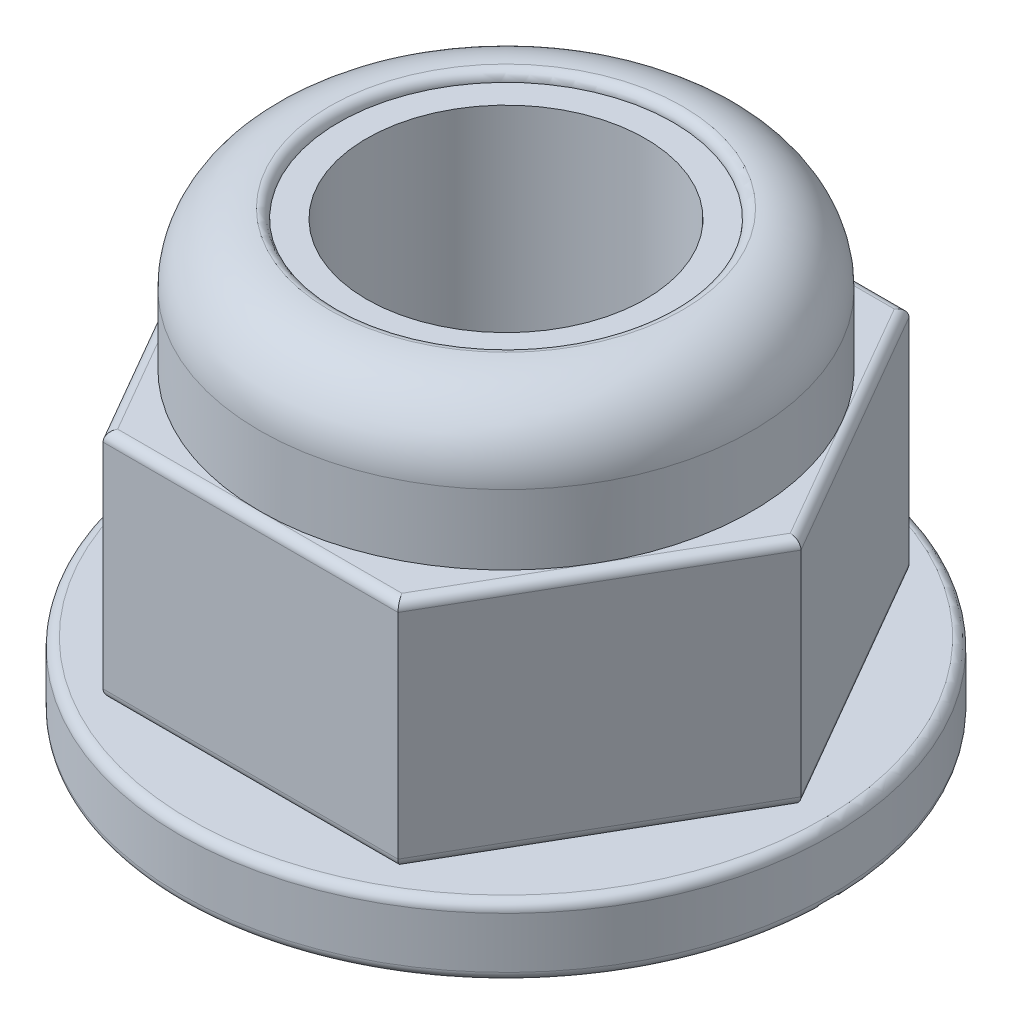
ISO-10303-21;
HEADER;
FILE_DESCRIPTION(('STEP AP214'),'2;1');
FILE_NAME('part.step','',(''),(''),'','','');
FILE_SCHEMA(('AUTOMOTIVE_DESIGN { 1 0 10303 214 1 1 1 1 }'));
ENDSEC;
DATA;
#1=APPLICATION_CONTEXT('core data for automotive mechanical design processes');
#2=APPLICATION_PROTOCOL_DEFINITION('international standard','automotive_design',2000,#1);
#3=PRODUCT_CONTEXT('',#1,'mechanical');
#4=PRODUCT('Part','Part','',(#3));
#5=PRODUCT_RELATED_PRODUCT_CATEGORY('part','',(#4));
#6=PRODUCT_DEFINITION_FORMATION('','',#4);
#7=PRODUCT_DEFINITION_CONTEXT('part definition',#1,'design');
#8=PRODUCT_DEFINITION('design','',#6,#7);
#9=PRODUCT_DEFINITION_SHAPE('','',#8);
#10=(LENGTH_UNIT() NAMED_UNIT(*) SI_UNIT(.MILLI.,.METRE.));
#11=(NAMED_UNIT(*) PLANE_ANGLE_UNIT() SI_UNIT($,.RADIAN.));
#12=(NAMED_UNIT(*) SI_UNIT($,.STERADIAN.) SOLID_ANGLE_UNIT());
#13=UNCERTAINTY_MEASURE_WITH_UNIT(LENGTH_MEASURE(1.E-05),#10,'distance_accuracy_value','');
#14=(GEOMETRIC_REPRESENTATION_CONTEXT(3) GLOBAL_UNCERTAINTY_ASSIGNED_CONTEXT((#13)) GLOBAL_UNIT_ASSIGNED_CONTEXT((#10,
#11,#12)) REPRESENTATION_CONTEXT('',''));
#15=CARTESIAN_POINT('',(0.,0.,0.));
#16=DIRECTION('',(0.,0.,1.));
#17=DIRECTION('',(1.,0.,0.));
#18=AXIS2_PLACEMENT_3D('',#15,#16,#17);
#19=CARTESIAN_POINT('',(0.,4.,0.));
#20=DIRECTION('',(0.,-1.,0.));
#21=DIRECTION('',(0.,0.,-1.));
#22=AXIS2_PLACEMENT_3D('',#19,#20,#21);
#23=CYLINDRICAL_SURFACE('',#22,1.5);
#24=CARTESIAN_POINT('',(0.,0.0999999999999998,0.));
#25=DIRECTION('',(0.,1.,0.));
#26=DIRECTION('',(0.,0.,1.));
#27=AXIS2_PLACEMENT_3D('',#24,#25,#26);
#28=CIRCLE('',#27,1.5);
#29=CARTESIAN_POINT('',(0.,0.0999999999999998,1.5));
#30=VERTEX_POINT('',#29);
#31=EDGE_CURVE('E174',#30,#30,#28,.F.);
#32=ORIENTED_EDGE('',*,*,#31,.T.);
#33=EDGE_LOOP('',(#32));
#34=FACE_BOUND('',#33,.T.);
#35=CARTESIAN_POINT('',(0.,3.9,0.));
#36=DIRECTION('',(0.,1.,0.));
#37=DIRECTION('',(0.,0.,1.));
#38=AXIS2_PLACEMENT_3D('',#35,#36,#37);
#39=CIRCLE('',#38,1.5);
#40=CARTESIAN_POINT('',(0.,3.9,1.5));
#41=VERTEX_POINT('',#40);
#42=EDGE_CURVE('E694',#41,#41,#39,.T.);
#43=ORIENTED_EDGE('',*,*,#42,.T.);
#44=EDGE_LOOP('',(#43));
#45=FACE_BOUND('',#44,.T.);
#46=ADVANCED_FACE('F33',(#34,#45),#23,.F.);
#47=CARTESIAN_POINT('',(0.,2.5,2.65));
#48=DIRECTION('',(0.,-1.,0.));
#49=DIRECTION('',(0.,0.,-1.));
#50=AXIS2_PLACEMENT_3D('',#47,#48,#49);
#51=PLANE('',#50);
#52=DIRECTION('',(-1.,0.,0.));
#53=VECTOR('',#52,1.);
#54=CARTESIAN_POINT('',(0.,2.5,2.65));
#55=LINE('',#54,#53);
#56=CARTESIAN_POINT('',(0.,2.5,2.65));
#57=VERTEX_POINT('',#56);
#58=CARTESIAN_POINT('',(1.52997821335251,2.5,2.65));
#59=VERTEX_POINT('',#58);
#60=EDGE_CURVE('E48',#57,#59,#55,.F.);
#61=ORIENTED_EDGE('',*,*,#60,.T.);
#62=DIRECTION('',(-0.5,0.,0.866025403784439));
#63=VECTOR('',#62,1.);
#64=CARTESIAN_POINT('',(1.14748366001438,2.5,3.3125));
#65=LINE('',#64,#63);
#66=CARTESIAN_POINT('',(2.29496732002876,2.5,1.325));
#67=VERTEX_POINT('',#66);
#68=EDGE_CURVE('E227',#59,#67,#65,.F.);
#69=ORIENTED_EDGE('',*,*,#68,.T.);
#70=CARTESIAN_POINT('',(0.,2.5,0.));
#71=DIRECTION('',(0.,1.,0.));
#72=DIRECTION('',(0.,0.,1.));
#73=AXIS2_PLACEMENT_3D('',#70,#71,#72);
#74=CIRCLE('',#73,2.65);
#75=EDGE_CURVE('E679',#57,#67,#74,.T.);
#76=ORIENTED_EDGE('',*,*,#75,.F.);
#77=EDGE_LOOP('',(#61,#69,#76));
#78=FACE_BOUND('',#77,.T.);
#79=ADVANCED_FACE('F301',(#78),#51,.F.);
#80=CARTESIAN_POINT('',(2.29496732002876,2.5,-1.325));
#81=VERTEX_POINT('',#80);
#82=EDGE_CURVE('E680',#67,#81,#74,.T.);
#83=ORIENTED_EDGE('',*,*,#82,.F.);
#84=DIRECTION('',(-0.5,0.,0.866025403784439));
#85=VECTOR('',#84,1.);
#86=CARTESIAN_POINT('',(1.14748366001438,2.5,3.3125));
#87=LINE('',#86,#85);
#88=CARTESIAN_POINT('',(3.05995642670502,2.5,0.));
#89=VERTEX_POINT('',#88);
#90=EDGE_CURVE('E56',#67,#89,#87,.F.);
#91=ORIENTED_EDGE('',*,*,#90,.T.);
#92=DIRECTION('',(0.5,0.,0.866025403784439));
#93=VECTOR('',#92,1.);
#94=CARTESIAN_POINT('',(3.44245098004314,2.5,0.6625));
#95=LINE('',#94,#93);
#96=EDGE_CURVE('E223',#89,#81,#95,.F.);
#97=ORIENTED_EDGE('',*,*,#96,.T.);
#98=EDGE_LOOP('',(#83,#91,#97));
#99=FACE_BOUND('',#98,.T.);
#100=ADVANCED_FACE('F307',(#99),#51,.F.);
#101=CARTESIAN_POINT('',(0.,2.5,-2.65));
#102=VERTEX_POINT('',#101);
#103=EDGE_CURVE('E668',#81,#102,#74,.T.);
#104=ORIENTED_EDGE('',*,*,#103,.F.);
#105=DIRECTION('',(0.5,0.,0.866025403784439));
#106=VECTOR('',#105,1.);
#107=CARTESIAN_POINT('',(3.44245098004314,2.5,0.6625));
#108=LINE('',#107,#106);
#109=CARTESIAN_POINT('',(1.52997821335251,2.5,-2.65));
#110=VERTEX_POINT('',#109);
#111=EDGE_CURVE('E221',#81,#110,#108,.F.);
#112=ORIENTED_EDGE('',*,*,#111,.T.);
#113=DIRECTION('',(1.,0.,0.));
#114=VECTOR('',#113,1.);
#115=CARTESIAN_POINT('',(0.,2.5,-2.65));
#116=LINE('',#115,#114);
#117=EDGE_CURVE('E218',#110,#102,#116,.F.);
#118=ORIENTED_EDGE('',*,*,#117,.T.);
#119=EDGE_LOOP('',(#104,#112,#118));
#120=FACE_BOUND('',#119,.T.);
#121=ADVANCED_FACE('F547',(#120),#51,.F.);
#122=CARTESIAN_POINT('',(-2.29496732002876,2.5,-1.325));
#123=VERTEX_POINT('',#122);
#124=EDGE_CURVE('E660',#102,#123,#74,.T.);
#125=ORIENTED_EDGE('',*,*,#124,.F.);
#126=DIRECTION('',(1.,0.,0.));
#127=VECTOR('',#126,1.);
#128=CARTESIAN_POINT('',(0.,2.5,-2.65));
#129=LINE('',#128,#127);
#130=CARTESIAN_POINT('',(-1.52997821335251,2.5,-2.65));
#131=VERTEX_POINT('',#130);
#132=EDGE_CURVE('E216',#102,#131,#129,.F.);
#133=ORIENTED_EDGE('',*,*,#132,.T.);
#134=DIRECTION('',(0.5,0.,-0.866025403784439));
#135=VECTOR('',#134,1.);
#136=CARTESIAN_POINT('',(-3.44245098004314,2.5,0.6625));
#137=LINE('',#136,#135);
#138=EDGE_CURVE('E212',#131,#123,#137,.F.);
#139=ORIENTED_EDGE('',*,*,#138,.T.);
#140=EDGE_LOOP('',(#125,#133,#139));
#141=FACE_BOUND('',#140,.T.);
#142=ADVANCED_FACE('F554',(#141),#51,.F.);
#143=DIRECTION('',(-0.5,0.,-0.866025403784439));
#144=VECTOR('',#143,1.);
#145=CARTESIAN_POINT('',(-1.14748366001438,2.5,3.3125));
#146=LINE('',#145,#144);
#147=CARTESIAN_POINT('',(-2.29496732002876,2.5,1.325));
#148=VERTEX_POINT('',#147);
#149=CARTESIAN_POINT('',(-1.52997821335251,2.5,2.65));
#150=VERTEX_POINT('',#149);
#151=EDGE_CURVE('E206',#148,#150,#146,.F.);
#152=ORIENTED_EDGE('',*,*,#151,.T.);
#153=DIRECTION('',(-1.,0.,0.));
#154=VECTOR('',#153,1.);
#155=CARTESIAN_POINT('',(0.,2.5,2.65));
#156=LINE('',#155,#154);
#157=EDGE_CURVE('E214',#150,#57,#156,.F.);
#158=ORIENTED_EDGE('',*,*,#157,.T.);
#159=EDGE_CURVE('E661',#148,#57,#74,.T.);
#160=ORIENTED_EDGE('',*,*,#159,.F.);
#161=EDGE_LOOP('',(#152,#158,#160));
#162=FACE_BOUND('',#161,.T.);
#163=ADVANCED_FACE('F337',(#162),#51,.F.);
#164=CARTESIAN_POINT('',(-1.58771324027147,4.,2.75));
#165=DIRECTION('',(0.,0.,-1.));
#166=DIRECTION('',(-1.,0.,0.));
#167=AXIS2_PLACEMENT_3D('',#164,#165,#166);
#168=PLANE('',#167);
#169=DIRECTION('',(0.,-1.,0.));
#170=VECTOR('',#169,1.);
#171=CARTESIAN_POINT('',(-1.58771324027147,4.,2.75));
#172=LINE('',#171,#170);
#173=CARTESIAN_POINT('',(-1.58771324027147,2.4,2.75));
#174=VERTEX_POINT('',#173);
#175=CARTESIAN_POINT('',(-1.58771324027147,0.0999999999999998,2.75));
#176=VERTEX_POINT('',#175);
#177=EDGE_CURVE('E685',#174,#176,#172,.T.);
#178=ORIENTED_EDGE('',*,*,#177,.T.);
#179=DIRECTION('',(1.,0.,0.));
#180=VECTOR('',#179,1.);
#181=CARTESIAN_POINT('',(-1.58771324027147,0.0999999999999998,2.75));
#182=LINE('',#181,#180);
#183=CARTESIAN_POINT('',(1.58771324027147,0.0999999999999998,2.75));
#184=VERTEX_POINT('',#183);
#185=EDGE_CURVE('E204',#176,#184,#182,.T.);
#186=ORIENTED_EDGE('',*,*,#185,.T.);
#187=DIRECTION('',(0.,-1.,0.));
#188=VECTOR('',#187,1.);
#189=CARTESIAN_POINT('',(1.58771324027147,4.,2.75));
#190=LINE('',#189,#188);
#191=CARTESIAN_POINT('',(1.58771324027147,2.4,2.75));
#192=VERTEX_POINT('',#191);
#193=EDGE_CURVE('E155',#192,#184,#190,.T.);
#194=ORIENTED_EDGE('',*,*,#193,.F.);
#195=DIRECTION('',(-1.,0.,0.));
#196=VECTOR('',#195,1.);
#197=CARTESIAN_POINT('',(-1.58771324027147,2.4,2.75));
#198=LINE('',#197,#196);
#199=EDGE_CURVE('E202',#192,#174,#198,.T.);
#200=ORIENTED_EDGE('',*,*,#199,.T.);
#201=EDGE_LOOP('',(#178,#186,#194,#200));
#202=FACE_BOUND('',#201,.T.);
#203=ADVANCED_FACE('F333',(#202),#168,.F.);
#204=CARTESIAN_POINT('',(1.58771324027147,4.,2.75));
#205=DIRECTION('',(-0.866025403784439,0.,-0.5));
#206=DIRECTION('',(-0.5,0.,0.866025403784439));
#207=AXIS2_PLACEMENT_3D('',#204,#205,#206);
#208=PLANE('',#207);
#209=ORIENTED_EDGE('',*,*,#193,.T.);
#210=DIRECTION('',(0.5,0.,-0.866025403784439));
#211=VECTOR('',#210,1.);
#212=CARTESIAN_POINT('',(1.58771324027147,0.0999999999999998,2.75));
#213=LINE('',#212,#211);
#214=CARTESIAN_POINT('',(3.17542648054294,0.0999999999999998,0.));
#215=VERTEX_POINT('',#214);
#216=EDGE_CURVE('E162',#184,#215,#213,.T.);
#217=ORIENTED_EDGE('',*,*,#216,.T.);
#218=DIRECTION('',(0.,-1.,0.));
#219=VECTOR('',#218,1.);
#220=CARTESIAN_POINT('',(3.17542648054294,4.,0.));
#221=LINE('',#220,#219);
#222=CARTESIAN_POINT('',(3.17542648054294,2.4,0.));
#223=VERTEX_POINT('',#222);
#224=EDGE_CURVE('E712',#223,#215,#221,.T.);
#225=ORIENTED_EDGE('',*,*,#224,.F.);
#226=DIRECTION('',(-0.5,0.,0.866025403784439));
#227=VECTOR('',#226,1.);
#228=CARTESIAN_POINT('',(1.58771324027147,2.4,2.75));
#229=LINE('',#228,#227);
#230=EDGE_CURVE('E182',#223,#192,#229,.T.);
#231=ORIENTED_EDGE('',*,*,#230,.T.);
#232=EDGE_LOOP('',(#209,#217,#225,#231));
#233=FACE_BOUND('',#232,.T.);
#234=ADVANCED_FACE('F329',(#233),#208,.F.);
#235=CARTESIAN_POINT('',(3.17542648054294,4.,0.));
#236=DIRECTION('',(-0.866025403784439,0.,0.5));
#237=DIRECTION('',(0.5,0.,0.866025403784439));
#238=AXIS2_PLACEMENT_3D('',#235,#236,#237);
#239=PLANE('',#238);
#240=ORIENTED_EDGE('',*,*,#224,.T.);
#241=DIRECTION('',(-0.5,0.,-0.866025403784439));
#242=VECTOR('',#241,1.);
#243=CARTESIAN_POINT('',(3.17542648054294,0.0999999999999998,0.));
#244=LINE('',#243,#242);
#245=CARTESIAN_POINT('',(1.58771324027147,0.0999999999999998,-2.75));
#246=VERTEX_POINT('',#245);
#247=EDGE_CURVE('E187',#215,#246,#244,.T.);
#248=ORIENTED_EDGE('',*,*,#247,.T.);
#249=DIRECTION('',(0.,-1.,0.));
#250=VECTOR('',#249,1.);
#251=CARTESIAN_POINT('',(1.58771324027147,4.,-2.75));
#252=LINE('',#251,#250);
#253=CARTESIAN_POINT('',(1.58771324027147,2.4,-2.75));
#254=VERTEX_POINT('',#253);
#255=EDGE_CURVE('E709',#254,#246,#252,.T.);
#256=ORIENTED_EDGE('',*,*,#255,.F.);
#257=DIRECTION('',(0.5,0.,0.866025403784439));
#258=VECTOR('',#257,1.);
#259=CARTESIAN_POINT('',(3.17542648054294,2.4,0.));
#260=LINE('',#259,#258);
#261=EDGE_CURVE('E185',#254,#223,#260,.T.);
#262=ORIENTED_EDGE('',*,*,#261,.T.);
#263=EDGE_LOOP('',(#240,#248,#256,#262));
#264=FACE_BOUND('',#263,.T.);
#265=ADVANCED_FACE('F325',(#264),#239,.F.);
#266=CARTESIAN_POINT('',(1.58771324027147,4.,-2.75));
#267=DIRECTION('',(0.,0.,1.));
#268=DIRECTION('',(1.,0.,0.));
#269=AXIS2_PLACEMENT_3D('',#266,#267,#268);
#270=PLANE('',#269);
#271=ORIENTED_EDGE('',*,*,#255,.T.);
#272=DIRECTION('',(-1.,0.,0.));
#273=VECTOR('',#272,1.);
#274=CARTESIAN_POINT('',(1.58771324027147,0.0999999999999998,-2.75));
#275=LINE('',#274,#273);
#276=CARTESIAN_POINT('',(-1.58771324027147,0.0999999999999998,-2.75));
#277=VERTEX_POINT('',#276);
#278=EDGE_CURVE('E192',#246,#277,#275,.T.);
#279=ORIENTED_EDGE('',*,*,#278,.T.);
#280=DIRECTION('',(0.,-1.,0.));
#281=VECTOR('',#280,1.);
#282=CARTESIAN_POINT('',(-1.58771324027147,4.,-2.75));
#283=LINE('',#282,#281);
#284=CARTESIAN_POINT('',(-1.58771324027147,2.4,-2.75));
#285=VERTEX_POINT('',#284);
#286=EDGE_CURVE('E706',#285,#277,#283,.T.);
#287=ORIENTED_EDGE('',*,*,#286,.F.);
#288=DIRECTION('',(1.,0.,0.));
#289=VECTOR('',#288,1.);
#290=CARTESIAN_POINT('',(1.58771324027147,2.4,-2.75));
#291=LINE('',#290,#289);
#292=EDGE_CURVE('E189',#285,#254,#291,.T.);
#293=ORIENTED_EDGE('',*,*,#292,.T.);
#294=EDGE_LOOP('',(#271,#279,#287,#293));
#295=FACE_BOUND('',#294,.T.);
#296=ADVANCED_FACE('F321',(#295),#270,.F.);
#297=CARTESIAN_POINT('',(-1.58771324027147,4.,-2.75));
#298=DIRECTION('',(0.866025403784439,0.,0.5));
#299=DIRECTION('',(0.5,0.,-0.866025403784439));
#300=AXIS2_PLACEMENT_3D('',#297,#298,#299);
#301=PLANE('',#300);
#302=ORIENTED_EDGE('',*,*,#286,.T.);
#303=DIRECTION('',(-0.5,0.,0.866025403784439));
#304=VECTOR('',#303,1.);
#305=CARTESIAN_POINT('',(-1.58771324027147,0.0999999999999998,-2.75));
#306=LINE('',#305,#304);
#307=CARTESIAN_POINT('',(-3.17542648054294,0.0999999999999998,0.));
#308=VERTEX_POINT('',#307);
#309=EDGE_CURVE('E196',#277,#308,#306,.T.);
#310=ORIENTED_EDGE('',*,*,#309,.T.);
#311=DIRECTION('',(0.,-1.,0.));
#312=VECTOR('',#311,1.);
#313=CARTESIAN_POINT('',(-3.17542648054294,4.,0.));
#314=LINE('',#313,#312);
#315=CARTESIAN_POINT('',(-3.17542648054294,2.4,0.));
#316=VERTEX_POINT('',#315);
#317=EDGE_CURVE('E703',#316,#308,#314,.T.);
#318=ORIENTED_EDGE('',*,*,#317,.F.);
#319=DIRECTION('',(0.5,0.,-0.866025403784439));
#320=VECTOR('',#319,1.);
#321=CARTESIAN_POINT('',(-1.58771324027147,2.4,-2.75));
#322=LINE('',#321,#320);
#323=EDGE_CURVE('E194',#316,#285,#322,.T.);
#324=ORIENTED_EDGE('',*,*,#323,.T.);
#325=EDGE_LOOP('',(#302,#310,#318,#324));
#326=FACE_BOUND('',#325,.T.);
#327=ADVANCED_FACE('F317',(#326),#301,.F.);
#328=CARTESIAN_POINT('',(-3.17542648054294,4.,0.));
#329=DIRECTION('',(0.866025403784439,0.,-0.5));
#330=DIRECTION('',(-0.5,0.,-0.866025403784439));
#331=AXIS2_PLACEMENT_3D('',#328,#329,#330);
#332=PLANE('',#331);
#333=ORIENTED_EDGE('',*,*,#317,.T.);
#334=DIRECTION('',(0.5,0.,0.866025403784439));
#335=VECTOR('',#334,1.);
#336=CARTESIAN_POINT('',(-3.17542648054294,0.0999999999999998,0.));
#337=LINE('',#336,#335);
#338=EDGE_CURVE('E200',#308,#176,#337,.T.);
#339=ORIENTED_EDGE('',*,*,#338,.T.);
#340=ORIENTED_EDGE('',*,*,#177,.F.);
#341=DIRECTION('',(-0.5,0.,-0.866025403784439));
#342=VECTOR('',#341,1.);
#343=CARTESIAN_POINT('',(-3.17542648054294,2.4,0.));
#344=LINE('',#343,#342);
#345=EDGE_CURVE('E198',#174,#316,#344,.T.);
#346=ORIENTED_EDGE('',*,*,#345,.T.);
#347=EDGE_LOOP('',(#333,#339,#340,#346));
#348=FACE_BOUND('',#347,.T.);
#349=ADVANCED_FACE('F314',(#348),#332,.F.);
#350=EDGE_CURVE('E652',#123,#148,#74,.T.);
#351=ORIENTED_EDGE('',*,*,#350,.F.);
#352=DIRECTION('',(0.5,0.,-0.866025403784439));
#353=VECTOR('',#352,1.);
#354=CARTESIAN_POINT('',(-3.44245098004314,2.5,0.6625));
#355=LINE('',#354,#353);
#356=CARTESIAN_POINT('',(-3.05995642670502,2.5,0.));
#357=VERTEX_POINT('',#356);
#358=EDGE_CURVE('E210',#123,#357,#355,.F.);
#359=ORIENTED_EDGE('',*,*,#358,.T.);
#360=DIRECTION('',(-0.5,0.,-0.866025403784439));
#361=VECTOR('',#360,1.);
#362=CARTESIAN_POINT('',(-1.14748366001438,2.5,3.3125));
#363=LINE('',#362,#361);
#364=EDGE_CURVE('E208',#357,#148,#363,.F.);
#365=ORIENTED_EDGE('',*,*,#364,.T.);
#366=EDGE_LOOP('',(#351,#359,#365));
#367=FACE_BOUND('',#366,.T.);
#368=ADVANCED_FACE('F309',(#367),#51,.F.);
#369=CARTESIAN_POINT('',(0.,3.25,0.));
#370=DIRECTION('',(0.,1.,0.));
#371=DIRECTION('',(0.,0.,1.));
#372=AXIS2_PLACEMENT_3D('',#369,#370,#371);
#373=TOROIDAL_SURFACE('',#372,1.9,0.75);
#374=CARTESIAN_POINT('',(0.,4.,0.));
#375=DIRECTION('',(0.,1.,0.));
#376=DIRECTION('',(0.,0.,1.));
#377=AXIS2_PLACEMENT_3D('',#374,#375,#376);
#378=CIRCLE('',#377,1.9);
#379=CARTESIAN_POINT('',(0.,4.,1.9));
#380=VERTEX_POINT('',#379);
#381=EDGE_CURVE('E683',#380,#380,#378,.T.);
#382=ORIENTED_EDGE('',*,*,#381,.F.);
#383=EDGE_LOOP('',(#382));
#384=FACE_BOUND('',#383,.T.);
#385=CARTESIAN_POINT('',(0.,3.25,0.));
#386=DIRECTION('',(0.,1.,0.));
#387=DIRECTION('',(0.,0.,1.));
#388=AXIS2_PLACEMENT_3D('',#385,#386,#387);
#389=CIRCLE('',#388,2.65);
#390=CARTESIAN_POINT('',(0.,3.25,2.65));
#391=VERTEX_POINT('',#390);
#392=EDGE_CURVE('E241',#391,#391,#389,.T.);
#393=ORIENTED_EDGE('',*,*,#392,.T.);
#394=EDGE_LOOP('',(#393));
#395=FACE_BOUND('',#394,.T.);
#396=ADVANCED_FACE('F313',(#384,#395),#373,.T.);
#397=CARTESIAN_POINT('',(0.,4.,0.));
#398=DIRECTION('',(0.,1.,0.));
#399=DIRECTION('',(0.,0.,1.));
#400=AXIS2_PLACEMENT_3D('',#397,#398,#399);
#401=CYLINDRICAL_SURFACE('',#400,2.65);
#402=ORIENTED_EDGE('',*,*,#392,.F.);
#403=EDGE_LOOP('',(#402));
#404=FACE_BOUND('',#403,.T.);
#405=ORIENTED_EDGE('',*,*,#75,.T.);
#406=ORIENTED_EDGE('',*,*,#82,.T.);
#407=ORIENTED_EDGE('',*,*,#103,.T.);
#408=ORIENTED_EDGE('',*,*,#124,.T.);
#409=ORIENTED_EDGE('',*,*,#350,.T.);
#410=ORIENTED_EDGE('',*,*,#159,.T.);
#411=EDGE_LOOP('',(#405,#406,#407,#408,#409,#410));
#412=FACE_BOUND('',#411,.T.);
#413=ADVANCED_FACE('F343',(#404,#412),#401,.T.);
#414=CARTESIAN_POINT('',(0.,0.0999999999999998,0.));
#415=DIRECTION('',(0.,1.,0.));
#416=DIRECTION('',(0.,0.,1.));
#417=AXIS2_PLACEMENT_3D('',#414,#415,#416);
#418=TOROIDAL_SURFACE('',#417,1.6,0.1);
#419=ORIENTED_EDGE('',*,*,#31,.F.);
#420=EDGE_LOOP('',(#419));
#421=FACE_BOUND('',#420,.T.);
#422=CARTESIAN_POINT('',(0.,0.,0.));
#423=DIRECTION('',(0.,1.,0.));
#424=DIRECTION('',(0.,0.,1.));
#425=AXIS2_PLACEMENT_3D('',#422,#423,#424);
#426=CIRCLE('',#425,1.6);
#427=CARTESIAN_POINT('',(0.,0.,1.6));
#428=VERTEX_POINT('',#427);
#429=EDGE_CURVE('E171',#428,#428,#426,.T.);
#430=ORIENTED_EDGE('',*,*,#429,.F.);
#431=EDGE_LOOP('',(#430));
#432=FACE_BOUND('',#431,.T.);
#433=ADVANCED_FACE('F339',(#421,#432),#418,.T.);
#434=CARTESIAN_POINT('',(-1.50111069989303,0.0999999999999998,-2.7));
#435=DIRECTION('',(-0.5,0.,0.866025403784439));
#436=DIRECTION('',(0.866025403784439,0.,0.5));
#437=AXIS2_PLACEMENT_3D('',#434,#435,#436);
#438=CYLINDRICAL_SURFACE('',#437,0.1);
#439=CARTESIAN_POINT('',(-1.52997821335251,0.0999999999999998,-2.65));
#440=DIRECTION('',(-0.866025403784439,0.,0.5));
#441=DIRECTION('',(0.5,0.,0.866025403784439));
#442=AXIS2_PLACEMENT_3D('',#439,#440,#441);
#443=ELLIPSE('',#442,0.115470053837925,0.1);
#444=CARTESIAN_POINT('',(-1.52997821335251,0.,-2.65));
#445=VERTEX_POINT('',#444);
#446=EDGE_CURVE('E235',#445,#277,#443,.F.);
#447=ORIENTED_EDGE('',*,*,#446,.F.);
#448=DIRECTION('',(-0.5,0.,0.866025403784439));
#449=VECTOR('',#448,1.);
#450=CARTESIAN_POINT('',(-2.29496732002876,0.,-1.325));
#451=LINE('',#450,#449);
#452=CARTESIAN_POINT('',(-3.05995642670502,0.,0.));
#453=VERTEX_POINT('',#452);
#454=EDGE_CURVE('E718',#453,#445,#451,.F.);
#455=ORIENTED_EDGE('',*,*,#454,.F.);
#456=CARTESIAN_POINT('',(-3.05995642670502,0.0999999999999998,0.));
#457=DIRECTION('',(0.,0.,1.));
#458=DIRECTION('',(1.,0.,0.));
#459=AXIS2_PLACEMENT_3D('',#456,#457,#458);
#460=ELLIPSE('',#459,0.115470053837925,0.1);
#461=EDGE_CURVE('E238',#308,#453,#460,.T.);
#462=ORIENTED_EDGE('',*,*,#461,.F.);
#463=ORIENTED_EDGE('',*,*,#309,.F.);
#464=EDGE_LOOP('',(#447,#455,#462,#463));
#465=FACE_BOUND('',#464,.T.);
#466=ADVANCED_FACE('F342',(#465),#438,.T.);
#467=CARTESIAN_POINT('',(-3.0888239401645,0.0999999999999998,-0.0500000000000006));
#468=DIRECTION('',(0.5,0.,0.866025403784439));
#469=DIRECTION('',(0.866025403784439,0.,-0.5));
#470=AXIS2_PLACEMENT_3D('',#467,#468,#469);
#471=CYLINDRICAL_SURFACE('',#470,0.1);
#472=ORIENTED_EDGE('',*,*,#461,.T.);
#473=DIRECTION('',(0.5,0.,0.866025403784439));
#474=VECTOR('',#473,1.);
#475=CARTESIAN_POINT('',(-2.29496732002876,0.,1.325));
#476=LINE('',#475,#474);
#477=CARTESIAN_POINT('',(-1.52997821335251,0.,2.65));
#478=VERTEX_POINT('',#477);
#479=EDGE_CURVE('E154',#478,#453,#476,.F.);
#480=ORIENTED_EDGE('',*,*,#479,.F.);
#481=CARTESIAN_POINT('',(-1.52997821335251,0.0999999999999998,2.65));
#482=DIRECTION('',(0.866025403784438,0.,0.5));
#483=DIRECTION('',(0.5,0.,-0.866025403784439));
#484=AXIS2_PLACEMENT_3D('',#481,#482,#483);
#485=ELLIPSE('',#484,0.115470053837925,0.1);
#486=EDGE_CURVE('E150',#176,#478,#485,.T.);
#487=ORIENTED_EDGE('',*,*,#486,.F.);
#488=ORIENTED_EDGE('',*,*,#338,.F.);
#489=EDGE_LOOP('',(#472,#480,#487,#488));
#490=FACE_BOUND('',#489,.T.);
#491=ADVANCED_FACE('F357',(#490),#471,.T.);
#492=CARTESIAN_POINT('',(1.58771324027147,0.0999999999999998,-2.65));
#493=DIRECTION('',(-1.,0.,0.));
#494=DIRECTION('',(0.,0.,1.));
#495=AXIS2_PLACEMENT_3D('',#492,#493,#494);
#496=CYLINDRICAL_SURFACE('',#495,0.1);
#497=ORIENTED_EDGE('',*,*,#446,.T.);
#498=ORIENTED_EDGE('',*,*,#278,.F.);
#499=CARTESIAN_POINT('',(1.52997821335251,0.0999999999999998,-2.65));
#500=DIRECTION('',(-0.866025403784439,0.,-0.5));
#501=DIRECTION('',(-0.5,0.,0.866025403784439));
#502=AXIS2_PLACEMENT_3D('',#499,#500,#501);
#503=ELLIPSE('',#502,0.115470053837925,0.1);
#504=CARTESIAN_POINT('',(1.52997821335251,0.,-2.65));
#505=VERTEX_POINT('',#504);
#506=EDGE_CURVE('E163',#505,#246,#503,.F.);
#507=ORIENTED_EDGE('',*,*,#506,.F.);
#508=DIRECTION('',(-1.,0.,0.));
#509=VECTOR('',#508,1.);
#510=CARTESIAN_POINT('',(0.,0.,-2.65));
#511=LINE('',#510,#509);
#512=EDGE_CURVE('E176',#445,#505,#511,.F.);
#513=ORIENTED_EDGE('',*,*,#512,.F.);
#514=EDGE_LOOP('',(#497,#498,#507,#513));
#515=FACE_BOUND('',#514,.T.);
#516=ADVANCED_FACE('F354',(#515),#496,.T.);
#517=CARTESIAN_POINT('',(-1.58771324027147,0.0999999999999998,2.65));
#518=DIRECTION('',(1.,0.,0.));
#519=DIRECTION('',(0.,0.,-1.));
#520=AXIS2_PLACEMENT_3D('',#517,#518,#519);
#521=CYLINDRICAL_SURFACE('',#520,0.1);
#522=ORIENTED_EDGE('',*,*,#486,.T.);
#523=DIRECTION('',(1.,0.,0.));
#524=VECTOR('',#523,1.);
#525=CARTESIAN_POINT('',(0.,0.,2.65));
#526=LINE('',#525,#524);
#527=CARTESIAN_POINT('',(1.52997821335251,0.,2.65));
#528=VERTEX_POINT('',#527);
#529=EDGE_CURVE('E143',#528,#478,#526,.F.);
#530=ORIENTED_EDGE('',*,*,#529,.F.);
#531=CARTESIAN_POINT('',(1.52997821335251,0.0999999999999998,2.65));
#532=DIRECTION('',(0.866025403784439,0.,-0.5));
#533=DIRECTION('',(0.5,0.,0.866025403784439));
#534=AXIS2_PLACEMENT_3D('',#531,#532,#533);
#535=ELLIPSE('',#534,0.115470053837925,0.1);
#536=EDGE_CURVE('E147',#184,#528,#535,.T.);
#537=ORIENTED_EDGE('',*,*,#536,.F.);
#538=ORIENTED_EDGE('',*,*,#185,.F.);
#539=EDGE_LOOP('',(#522,#530,#537,#538));
#540=FACE_BOUND('',#539,.T.);
#541=ADVANCED_FACE('F145',(#540),#521,.T.);
#542=CARTESIAN_POINT('',(3.0888239401645,0.0999999999999998,0.0500000000000004));
#543=DIRECTION('',(-0.5,0.,-0.866025403784439));
#544=DIRECTION('',(-0.866025403784439,0.,0.5));
#545=AXIS2_PLACEMENT_3D('',#542,#543,#544);
#546=CYLINDRICAL_SURFACE('',#545,0.1);
#547=ORIENTED_EDGE('',*,*,#506,.T.);
#548=ORIENTED_EDGE('',*,*,#247,.F.);
#549=CARTESIAN_POINT('',(3.05995642670502,0.0999999999999998,0.));
#550=DIRECTION('',(0.,0.,-1.));
#551=DIRECTION('',(-1.,0.,0.));
#552=AXIS2_PLACEMENT_3D('',#549,#550,#551);
#553=ELLIPSE('',#552,0.115470053837925,0.1);
#554=CARTESIAN_POINT('',(3.05995642670502,0.,0.));
#555=VERTEX_POINT('',#554);
#556=EDGE_CURVE('E164',#555,#215,#553,.F.);
#557=ORIENTED_EDGE('',*,*,#556,.F.);
#558=DIRECTION('',(-0.5,0.,-0.866025403784439));
#559=VECTOR('',#558,1.);
#560=CARTESIAN_POINT('',(2.29496732002876,0.,-1.325));
#561=LINE('',#560,#559);
#562=EDGE_CURVE('E170',#505,#555,#561,.F.);
#563=ORIENTED_EDGE('',*,*,#562,.F.);
#564=EDGE_LOOP('',(#547,#548,#557,#563));
#565=FACE_BOUND('',#564,.T.);
#566=ADVANCED_FACE('F348',(#565),#546,.T.);
#567=CARTESIAN_POINT('',(1.50111069989303,0.0999999999999998,2.7));
#568=DIRECTION('',(0.5,0.,-0.866025403784439));
#569=DIRECTION('',(-0.866025403784439,0.,-0.5));
#570=AXIS2_PLACEMENT_3D('',#567,#568,#569);
#571=CYLINDRICAL_SURFACE('',#570,0.1);
#572=ORIENTED_EDGE('',*,*,#536,.T.);
#573=DIRECTION('',(0.5,0.,-0.866025403784439));
#574=VECTOR('',#573,1.);
#575=CARTESIAN_POINT('',(2.29496732002876,0.,1.325));
#576=LINE('',#575,#574);
#577=EDGE_CURVE('E159',#555,#528,#576,.F.);
#578=ORIENTED_EDGE('',*,*,#577,.F.);
#579=ORIENTED_EDGE('',*,*,#556,.T.);
#580=ORIENTED_EDGE('',*,*,#216,.F.);
#581=EDGE_LOOP('',(#572,#578,#579,#580));
#582=FACE_BOUND('',#581,.T.);
#583=ADVANCED_FACE('F158',(#582),#571,.T.);
#584=CARTESIAN_POINT('',(-1.58771324027147,2.4,2.65));
#585=DIRECTION('',(-1.,0.,0.));
#586=DIRECTION('',(0.,0.,1.));
#587=AXIS2_PLACEMENT_3D('',#584,#585,#586);
#588=CYLINDRICAL_SURFACE('',#587,0.1);
#589=ORIENTED_EDGE('',*,*,#60,.F.);
#590=ORIENTED_EDGE('',*,*,#157,.F.);
#591=CARTESIAN_POINT('',(-1.52997821335251,2.4,2.65));
#592=DIRECTION('',(-0.866025403784438,0.,-0.5));
#593=DIRECTION('',(0.5,0.,-0.866025403784439));
#594=AXIS2_PLACEMENT_3D('',#591,#592,#593);
#595=ELLIPSE('',#594,0.115470053837925,0.1);
#596=EDGE_CURVE('E230',#174,#150,#595,.T.);
#597=ORIENTED_EDGE('',*,*,#596,.F.);
#598=ORIENTED_EDGE('',*,*,#199,.F.);
#599=CARTESIAN_POINT('',(1.52997821335251,2.4,2.65));
#600=DIRECTION('',(-0.866025403784439,0.,0.5));
#601=DIRECTION('',(-0.5,0.,-0.866025403784439));
#602=AXIS2_PLACEMENT_3D('',#599,#600,#601);
#603=ELLIPSE('',#602,0.115470053837925,0.1);
#604=EDGE_CURVE('E254',#59,#192,#603,.F.);
#605=ORIENTED_EDGE('',*,*,#604,.F.);
#606=EDGE_LOOP('',(#589,#590,#597,#598,#605));
#607=FACE_BOUND('',#606,.T.);
#608=ADVANCED_FACE('F347',(#607),#588,.T.);
#609=CARTESIAN_POINT('',(-3.0888239401645,2.4,-0.0500000000000004));
#610=DIRECTION('',(-0.5,0.,-0.866025403784439));
#611=DIRECTION('',(-0.866025403784439,0.,0.5));
#612=AXIS2_PLACEMENT_3D('',#609,#610,#611);
#613=CYLINDRICAL_SURFACE('',#612,0.1);
#614=ORIENTED_EDGE('',*,*,#151,.F.);
#615=ORIENTED_EDGE('',*,*,#364,.F.);
#616=CARTESIAN_POINT('',(-3.05995642670502,2.4,0.));
#617=DIRECTION('',(0.,0.,-1.));
#618=DIRECTION('',(-1.,0.,0.));
#619=AXIS2_PLACEMENT_3D('',#616,#617,#618);
#620=ELLIPSE('',#619,0.115470053837925,0.1);
#621=EDGE_CURVE('E251',#316,#357,#620,.T.);
#622=ORIENTED_EDGE('',*,*,#621,.F.);
#623=ORIENTED_EDGE('',*,*,#345,.F.);
#624=ORIENTED_EDGE('',*,*,#596,.T.);
#625=EDGE_LOOP('',(#614,#615,#622,#623,#624));
#626=FACE_BOUND('',#625,.T.);
#627=ADVANCED_FACE('F381',(#626),#613,.T.);
#628=CARTESIAN_POINT('',(1.50111069989303,2.4,2.7));
#629=DIRECTION('',(-0.5,0.,0.866025403784439));
#630=DIRECTION('',(0.866025403784439,0.,0.5));
#631=AXIS2_PLACEMENT_3D('',#628,#629,#630);
#632=CYLINDRICAL_SURFACE('',#631,0.1);
#633=ORIENTED_EDGE('',*,*,#604,.T.);
#634=ORIENTED_EDGE('',*,*,#230,.F.);
#635=CARTESIAN_POINT('',(3.05995642670502,2.4,0.));
#636=DIRECTION('',(0.,0.,1.));
#637=DIRECTION('',(1.,0.,0.));
#638=AXIS2_PLACEMENT_3D('',#635,#636,#637);
#639=ELLIPSE('',#638,0.115470053837925,0.1);
#640=EDGE_CURVE('E248',#89,#223,#639,.F.);
#641=ORIENTED_EDGE('',*,*,#640,.F.);
#642=ORIENTED_EDGE('',*,*,#90,.F.);
#643=ORIENTED_EDGE('',*,*,#68,.F.);
#644=EDGE_LOOP('',(#633,#634,#641,#642,#643));
#645=FACE_BOUND('',#644,.T.);
#646=ADVANCED_FACE('F377',(#645),#632,.T.);
#647=CARTESIAN_POINT('',(-1.50111069989303,2.4,-2.7));
#648=DIRECTION('',(0.5,0.,-0.866025403784439));
#649=DIRECTION('',(-0.866025403784439,0.,-0.5));
#650=AXIS2_PLACEMENT_3D('',#647,#648,#649);
#651=CYLINDRICAL_SURFACE('',#650,0.1);
#652=ORIENTED_EDGE('',*,*,#358,.F.);
#653=ORIENTED_EDGE('',*,*,#138,.F.);
#654=CARTESIAN_POINT('',(-1.52997821335251,2.4,-2.65));
#655=DIRECTION('',(0.866025403784439,0.,-0.5));
#656=DIRECTION('',(-0.5,0.,-0.866025403784439));
#657=AXIS2_PLACEMENT_3D('',#654,#655,#656);
#658=ELLIPSE('',#657,0.115470053837925,0.1);
#659=EDGE_CURVE('E244',#285,#131,#658,.T.);
#660=ORIENTED_EDGE('',*,*,#659,.F.);
#661=ORIENTED_EDGE('',*,*,#323,.F.);
#662=ORIENTED_EDGE('',*,*,#621,.T.);
#663=EDGE_LOOP('',(#652,#653,#660,#661,#662));
#664=FACE_BOUND('',#663,.T.);
#665=ADVANCED_FACE('F373',(#664),#651,.T.);
#666=CARTESIAN_POINT('',(3.0888239401645,2.4,0.0500000000000006));
#667=DIRECTION('',(0.5,0.,0.866025403784439));
#668=DIRECTION('',(0.866025403784439,0.,-0.5));
#669=AXIS2_PLACEMENT_3D('',#666,#667,#668);
#670=CYLINDRICAL_SURFACE('',#669,0.1);
#671=ORIENTED_EDGE('',*,*,#640,.T.);
#672=ORIENTED_EDGE('',*,*,#261,.F.);
#673=CARTESIAN_POINT('',(1.52997821335251,2.4,-2.65));
#674=DIRECTION('',(0.866025403784439,0.,0.5));
#675=DIRECTION('',(-0.5,0.,0.866025403784439));
#676=AXIS2_PLACEMENT_3D('',#673,#674,#675);
#677=ELLIPSE('',#676,0.115470053837925,0.1);
#678=EDGE_CURVE('E242',#110,#254,#677,.F.);
#679=ORIENTED_EDGE('',*,*,#678,.F.);
#680=ORIENTED_EDGE('',*,*,#111,.F.);
#681=ORIENTED_EDGE('',*,*,#96,.F.);
#682=EDGE_LOOP('',(#671,#672,#679,#680,#681));
#683=FACE_BOUND('',#682,.T.);
#684=ADVANCED_FACE('F369',(#683),#670,.T.);
#685=CARTESIAN_POINT('',(1.58771324027147,2.4,-2.65));
#686=DIRECTION('',(1.,0.,0.));
#687=DIRECTION('',(0.,0.,-1.));
#688=AXIS2_PLACEMENT_3D('',#685,#686,#687);
#689=CYLINDRICAL_SURFACE('',#688,0.1);
#690=ORIENTED_EDGE('',*,*,#132,.F.);
#691=ORIENTED_EDGE('',*,*,#117,.F.);
#692=ORIENTED_EDGE('',*,*,#678,.T.);
#693=ORIENTED_EDGE('',*,*,#292,.F.);
#694=ORIENTED_EDGE('',*,*,#659,.T.);
#695=EDGE_LOOP('',(#690,#691,#692,#693,#694));
#696=FACE_BOUND('',#695,.T.);
#697=ADVANCED_FACE('F365',(#696),#689,.T.);
#698=CARTESIAN_POINT('',(0.,3.9,0.));
#699=DIRECTION('',(0.,1.,0.));
#700=DIRECTION('',(0.,0.,1.));
#701=AXIS2_PLACEMENT_3D('',#698,#699,#700);
#702=PLANE('',#701);
#703=ORIENTED_EDGE('',*,*,#42,.F.);
#704=EDGE_LOOP('',(#703));
#705=FACE_BOUND('',#704,.T.);
#706=CARTESIAN_POINT('',(0.,3.9,0.));
#707=DIRECTION('',(0.,1.,0.));
#708=DIRECTION('',(0.,0.,1.));
#709=AXIS2_PLACEMENT_3D('',#706,#707,#708);
#710=CIRCLE('',#709,1.8);
#711=CARTESIAN_POINT('',(0.,3.9,1.8));
#712=VERTEX_POINT('',#711);
#713=EDGE_CURVE('E245',#712,#712,#710,.T.);
#714=ORIENTED_EDGE('',*,*,#713,.T.);
#715=EDGE_LOOP('',(#714));
#716=FACE_BOUND('',#715,.T.);
#717=ADVANCED_FACE('F368',(#705,#716),#702,.T.);
#718=CARTESIAN_POINT('',(0.,3.9,0.));
#719=DIRECTION('',(0.,1.,0.));
#720=DIRECTION('',(0.,0.,1.));
#721=AXIS2_PLACEMENT_3D('',#718,#719,#720);
#722=TOROIDAL_SURFACE('',#721,1.9,0.1);
#723=ORIENTED_EDGE('',*,*,#381,.T.);
#724=EDGE_LOOP('',(#723));
#725=FACE_BOUND('',#724,.T.);
#726=ORIENTED_EDGE('',*,*,#713,.F.);
#727=EDGE_LOOP('',(#726));
#728=FACE_BOUND('',#727,.T.);
#729=ADVANCED_FACE('F296',(#725,#728),#722,.T.);
#730=CARTESIAN_POINT('',(0.,0.,0.));
#731=DIRECTION('',(0.,-1.,0.));
#732=DIRECTION('',(0.,0.,-1.));
#733=AXIS2_PLACEMENT_3D('',#730,#731,#732);
#734=PLANE('',#733);
#735=CARTESIAN_POINT('',(0.,0.,0.));
#736=DIRECTION('',(0.,-1.,0.));
#737=DIRECTION('',(0.,0.,-1.));
#738=AXIS2_PLACEMENT_3D('',#735,#736,#737);
#739=CIRCLE('',#738,3.4);
#740=CARTESIAN_POINT('',(0.,0.,-3.4));
#741=VERTEX_POINT('',#740);
#742=EDGE_CURVE('E11',#741,#741,#739,.F.);
#743=ORIENTED_EDGE('',*,*,#742,.T.);
#744=EDGE_LOOP('',(#743));
#745=FACE_BOUND('',#744,.T.);
#746=ORIENTED_EDGE('',*,*,#479,.T.);
#747=ORIENTED_EDGE('',*,*,#454,.T.);
#748=ORIENTED_EDGE('',*,*,#512,.T.);
#749=ORIENTED_EDGE('',*,*,#562,.T.);
#750=ORIENTED_EDGE('',*,*,#577,.T.);
#751=ORIENTED_EDGE('',*,*,#529,.T.);
#752=EDGE_LOOP('',(#746,#747,#748,#749,#750,#751));
#753=FACE_BOUND('',#752,.T.);
#754=ADVANCED_FACE('F167',(#745,#753),#734,.F.);
#755=CARTESIAN_POINT('',(0.,-0.75,0.));
#756=DIRECTION('',(0.,-1.,0.));
#757=DIRECTION('',(0.,0.,-1.));
#758=AXIS2_PLACEMENT_3D('',#755,#756,#757);
#759=PLANE('',#758);
#760=CARTESIAN_POINT('',(0.,-0.75,0.));
#761=DIRECTION('',(0.,-1.,0.));
#762=DIRECTION('',(0.,0.,-1.));
#763=AXIS2_PLACEMENT_3D('',#760,#761,#762);
#764=CIRCLE('',#763,1.6);
#765=CARTESIAN_POINT('',(0.,-0.75,-1.6));
#766=VERTEX_POINT('',#765);
#767=EDGE_CURVE('E267',#766,#766,#764,.F.);
#768=ORIENTED_EDGE('',*,*,#767,.T.);
#769=EDGE_LOOP('',(#768));
#770=FACE_BOUND('',#769,.T.);
#771=CARTESIAN_POINT('',(0.,-0.75,0.));
#772=DIRECTION('',(0.,-1.,0.));
#773=DIRECTION('',(0.,0.,-1.));
#774=AXIS2_PLACEMENT_3D('',#771,#772,#773);
#775=CIRCLE('',#774,3.4);
#776=CARTESIAN_POINT('',(0.,-0.75,-3.4));
#777=VERTEX_POINT('',#776);
#778=EDGE_CURVE('E264',#777,#777,#775,.T.);
#779=ORIENTED_EDGE('',*,*,#778,.T.);
#780=EDGE_LOOP('',(#779));
#781=FACE_BOUND('',#780,.T.);
#782=ADVANCED_FACE('F286',(#770,#781),#759,.T.);
#783=CARTESIAN_POINT('',(0.,-0.75,0.));
#784=DIRECTION('',(0.,1.,0.));
#785=DIRECTION('',(0.,0.,1.));
#786=AXIS2_PLACEMENT_3D('',#783,#784,#785);
#787=CYLINDRICAL_SURFACE('',#786,3.5);
#788=CARTESIAN_POINT('',(0.,-0.65,0.));
#789=DIRECTION('',(0.,-1.,0.));
#790=DIRECTION('',(0.,0.,-1.));
#791=AXIS2_PLACEMENT_3D('',#788,#789,#790);
#792=CIRCLE('',#791,3.5);
#793=CARTESIAN_POINT('',(0.,-0.65,-3.5));
#794=VERTEX_POINT('',#793);
#795=EDGE_CURVE('E41',#794,#794,#792,.F.);
#796=ORIENTED_EDGE('',*,*,#795,.T.);
#797=EDGE_LOOP('',(#796));
#798=FACE_BOUND('',#797,.T.);
#799=CARTESIAN_POINT('',(0.,-0.1,0.));
#800=DIRECTION('',(0.,-1.,0.));
#801=DIRECTION('',(0.,0.,-1.));
#802=AXIS2_PLACEMENT_3D('',#799,#800,#801);
#803=CIRCLE('',#802,3.5);
#804=CARTESIAN_POINT('',(0.,-0.1,-3.5));
#805=VERTEX_POINT('',#804);
#806=EDGE_CURVE('E270',#805,#805,#803,.T.);
#807=ORIENTED_EDGE('',*,*,#806,.T.);
#808=EDGE_LOOP('',(#807));
#809=FACE_BOUND('',#808,.T.);
#810=ADVANCED_FACE('F275',(#798,#809),#787,.T.);
#811=CARTESIAN_POINT('',(0.,-0.75,0.));
#812=DIRECTION('',(0.,1.,0.));
#813=DIRECTION('',(0.,0.,1.));
#814=AXIS2_PLACEMENT_3D('',#811,#812,#813);
#815=CYLINDRICAL_SURFACE('',#814,1.5);
#816=CARTESIAN_POINT('',(0.,-0.65,0.));
#817=DIRECTION('',(0.,-1.,0.));
#818=DIRECTION('',(0.,0.,-1.));
#819=AXIS2_PLACEMENT_3D('',#816,#817,#818);
#820=CIRCLE('',#819,1.5);
#821=CARTESIAN_POINT('',(0.,-0.65,-1.5));
#822=VERTEX_POINT('',#821);
#823=EDGE_CURVE('E261',#822,#822,#820,.T.);
#824=ORIENTED_EDGE('',*,*,#823,.T.);
#825=EDGE_LOOP('',(#824));
#826=FACE_BOUND('',#825,.T.);
#827=CARTESIAN_POINT('',(0.,-0.1,0.));
#828=DIRECTION('',(0.,-1.,0.));
#829=DIRECTION('',(0.,0.,-1.));
#830=AXIS2_PLACEMENT_3D('',#827,#828,#829);
#831=CIRCLE('',#830,1.5);
#832=CARTESIAN_POINT('',(0.,-0.1,-1.5));
#833=VERTEX_POINT('',#832);
#834=EDGE_CURVE('E229',#833,#833,#831,.F.);
#835=ORIENTED_EDGE('',*,*,#834,.T.);
#836=EDGE_LOOP('',(#835));
#837=FACE_BOUND('',#836,.T.);
#838=ADVANCED_FACE('F294',(#826,#837),#815,.F.);
#839=CARTESIAN_POINT('',(0.,-0.65,0.));
#840=DIRECTION('',(0.,-1.,0.));
#841=DIRECTION('',(0.,0.,-1.));
#842=AXIS2_PLACEMENT_3D('',#839,#840,#841);
#843=TOROIDAL_SURFACE('',#842,1.6,0.1);
#844=ORIENTED_EDGE('',*,*,#767,.F.);
#845=EDGE_LOOP('',(#844));
#846=FACE_BOUND('',#845,.T.);
#847=ORIENTED_EDGE('',*,*,#823,.F.);
#848=EDGE_LOOP('',(#847));
#849=FACE_BOUND('',#848,.T.);
#850=ADVANCED_FACE('F282',(#846,#849),#843,.T.);
#851=CARTESIAN_POINT('',(0.,-0.65,0.));
#852=DIRECTION('',(0.,-1.,0.));
#853=DIRECTION('',(0.,0.,-1.));
#854=AXIS2_PLACEMENT_3D('',#851,#852,#853);
#855=TOROIDAL_SURFACE('',#854,3.4,0.1);
#856=ORIENTED_EDGE('',*,*,#795,.F.);
#857=EDGE_LOOP('',(#856));
#858=FACE_BOUND('',#857,.T.);
#859=ORIENTED_EDGE('',*,*,#778,.F.);
#860=EDGE_LOOP('',(#859));
#861=FACE_BOUND('',#860,.T.);
#862=ADVANCED_FACE('F278',(#858,#861),#855,.T.);
#863=CARTESIAN_POINT('',(0.,-0.1,0.));
#864=DIRECTION('',(0.,-1.,0.));
#865=DIRECTION('',(0.,0.,-1.));
#866=AXIS2_PLACEMENT_3D('',#863,#864,#865);
#867=TOROIDAL_SURFACE('',#866,1.6,0.1);
#868=ORIENTED_EDGE('',*,*,#834,.F.);
#869=EDGE_LOOP('',(#868));
#870=FACE_BOUND('',#869,.T.);
#871=ORIENTED_EDGE('',*,*,#429,.T.);
#872=EDGE_LOOP('',(#871));
#873=FACE_BOUND('',#872,.T.);
#874=ADVANCED_FACE('F281',(#870,#873),#867,.T.);
#875=CARTESIAN_POINT('',(0.,-0.1,0.));
#876=DIRECTION('',(0.,-1.,0.));
#877=DIRECTION('',(0.,0.,-1.));
#878=AXIS2_PLACEMENT_3D('',#875,#876,#877);
#879=TOROIDAL_SURFACE('',#878,3.4,0.1);
#880=ORIENTED_EDGE('',*,*,#742,.F.);
#881=EDGE_LOOP('',(#880));
#882=FACE_BOUND('',#881,.T.);
#883=ORIENTED_EDGE('',*,*,#806,.F.);
#884=EDGE_LOOP('',(#883));
#885=FACE_BOUND('',#884,.T.);
#886=ADVANCED_FACE('F35',(#882,#885),#879,.T.);
#887=CLOSED_SHELL('',(#46,#79,#100,#121,#142,#163,#203,#234,#265,#296,#327,#349,#368,#396,#413,
#433,#466,#491,#516,#541,#566,#583,#608,#627,#646,#665,#684,#697,#717,#729,#754,#782,#810,#838,
#850,#862,#874,#886));
#888=MANIFOLD_SOLID_BREP('B2',#887);
#889=ADVANCED_BREP_SHAPE_REPRESENTATION('',(#18,#888),#14);
#890=SHAPE_DEFINITION_REPRESENTATION(#9,#889);
ENDSEC;
END-ISO-10303-21;
